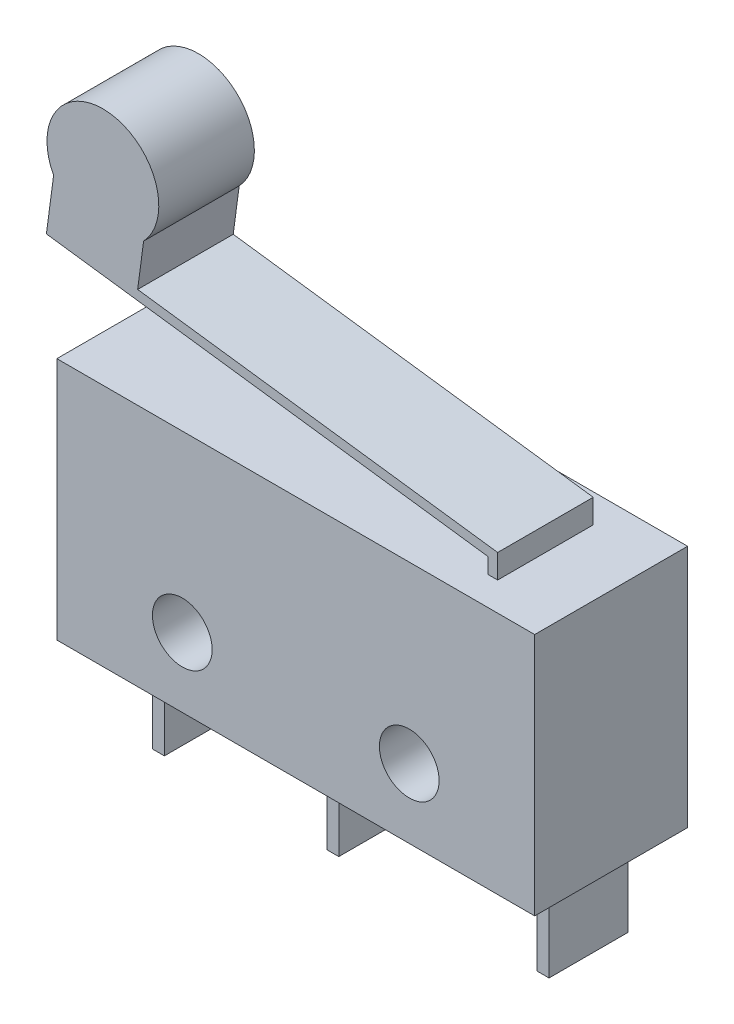
ISO-10303-21;
HEADER;
FILE_DESCRIPTION(('STEP AP214'),'2;1');
FILE_NAME('part.step','',(''),(''),'','','');
FILE_SCHEMA(('AUTOMOTIVE_DESIGN { 1 0 10303 214 1 1 1 1 }'));
ENDSEC;
DATA;
#1=APPLICATION_CONTEXT('core data for automotive mechanical design processes');
#2=APPLICATION_PROTOCOL_DEFINITION('international standard','automotive_design',2000,#1);
#3=PRODUCT_CONTEXT('',#1,'mechanical');
#4=PRODUCT('Part','Part','',(#3));
#5=PRODUCT_RELATED_PRODUCT_CATEGORY('part','',(#4));
#6=PRODUCT_DEFINITION_FORMATION('','',#4);
#7=PRODUCT_DEFINITION_CONTEXT('part definition',#1,'design');
#8=PRODUCT_DEFINITION('design','',#6,#7);
#9=PRODUCT_DEFINITION_SHAPE('','',#8);
#10=(LENGTH_UNIT() NAMED_UNIT(*) SI_UNIT(.MILLI.,.METRE.));
#11=(NAMED_UNIT(*) PLANE_ANGLE_UNIT() SI_UNIT($,.RADIAN.));
#12=(NAMED_UNIT(*) SI_UNIT($,.STERADIAN.) SOLID_ANGLE_UNIT());
#13=UNCERTAINTY_MEASURE_WITH_UNIT(LENGTH_MEASURE(1.E-05),#10,'distance_accuracy_value','');
#14=(GEOMETRIC_REPRESENTATION_CONTEXT(3) GLOBAL_UNCERTAINTY_ASSIGNED_CONTEXT((#13)) GLOBAL_UNIT_ASSIGNED_CONTEXT((#10,
#11,#12)) REPRESENTATION_CONTEXT('',''));
#15=CARTESIAN_POINT('',(0.,0.,0.));
#16=DIRECTION('',(0.,0.,1.));
#17=DIRECTION('',(1.,0.,0.));
#18=AXIS2_PLACEMENT_3D('',#15,#16,#17);
#19=CARTESIAN_POINT('',(-10.,-5.1,3.2));
#20=DIRECTION('',(0.,1.,0.));
#21=DIRECTION('',(0.,0.,1.));
#22=AXIS2_PLACEMENT_3D('',#19,#20,#21);
#23=PLANE('',#22);
#24=DIRECTION('',(-1.,0.,0.));
#25=VECTOR('',#24,1.);
#26=CARTESIAN_POINT('',(-7.05,-5.1,1.65));
#27=LINE('',#26,#25);
#28=CARTESIAN_POINT('',(-7.05,-5.1,1.65));
#29=VERTEX_POINT('',#28);
#30=CARTESIAN_POINT('',(-7.55,-5.1,1.65));
#31=VERTEX_POINT('',#30);
#32=EDGE_CURVE('E61',#29,#31,#27,.T.);
#33=ORIENTED_EDGE('',*,*,#32,.F.);
#34=DIRECTION('',(0.,0.,1.));
#35=VECTOR('',#34,1.);
#36=CARTESIAN_POINT('',(-7.05,-5.1,-1.65));
#37=LINE('',#36,#35);
#38=CARTESIAN_POINT('',(-7.05,-5.1,-1.65));
#39=VERTEX_POINT('',#38);
#40=EDGE_CURVE('E66',#39,#29,#37,.T.);
#41=ORIENTED_EDGE('',*,*,#40,.F.);
#42=DIRECTION('',(-1.,0.,0.));
#43=VECTOR('',#42,1.);
#44=CARTESIAN_POINT('',(-7.05,-5.1,-1.65));
#45=LINE('',#44,#43);
#46=CARTESIAN_POINT('',(-7.55,-5.1,-1.65));
#47=VERTEX_POINT('',#46);
#48=EDGE_CURVE('E230',#39,#47,#45,.T.);
#49=ORIENTED_EDGE('',*,*,#48,.T.);
#50=DIRECTION('',(0.,0.,1.));
#51=VECTOR('',#50,1.);
#52=CARTESIAN_POINT('',(-7.55,-5.1,-1.65));
#53=LINE('',#52,#51);
#54=EDGE_CURVE('E234',#47,#31,#53,.T.);
#55=ORIENTED_EDGE('',*,*,#54,.T.);
#56=EDGE_LOOP('',(#33,#41,#49,#55));
#57=FACE_BOUND('',#56,.T.);
#58=DIRECTION('',(1.,0.,0.));
#59=VECTOR('',#58,1.);
#60=CARTESIAN_POINT('',(-10.,-5.1,-3.2));
#61=LINE('',#60,#59);
#62=CARTESIAN_POINT('',(-10.,-5.1,-3.2));
#63=VERTEX_POINT('',#62);
#64=CARTESIAN_POINT('',(10.,-5.1,-3.2));
#65=VERTEX_POINT('',#64);
#66=EDGE_CURVE('E445',#63,#65,#61,.T.);
#67=ORIENTED_EDGE('',*,*,#66,.T.);
#68=DIRECTION('',(0.,0.,-1.));
#69=VECTOR('',#68,1.);
#70=CARTESIAN_POINT('',(10.,-5.1,3.2));
#71=LINE('',#70,#69);
#72=CARTESIAN_POINT('',(10.,-5.1,3.2));
#73=VERTEX_POINT('',#72);
#74=EDGE_CURVE('E454',#73,#65,#71,.T.);
#75=ORIENTED_EDGE('',*,*,#74,.F.);
#76=DIRECTION('',(1.,0.,0.));
#77=VECTOR('',#76,1.);
#78=CARTESIAN_POINT('',(-10.,-5.1,3.2));
#79=LINE('',#78,#77);
#80=CARTESIAN_POINT('',(-10.,-5.1,3.2));
#81=VERTEX_POINT('',#80);
#82=EDGE_CURVE('E451',#81,#73,#79,.T.);
#83=ORIENTED_EDGE('',*,*,#82,.F.);
#84=DIRECTION('',(0.,0.,-1.));
#85=VECTOR('',#84,1.);
#86=CARTESIAN_POINT('',(-10.,-5.1,3.2));
#87=LINE('',#86,#85);
#88=EDGE_CURVE('E469',#81,#63,#87,.T.);
#89=ORIENTED_EDGE('',*,*,#88,.T.);
#90=EDGE_LOOP('',(#67,#75,#83,#89));
#91=FACE_BOUND('',#90,.T.);
#92=DIRECTION('',(-1.,0.,0.));
#93=VECTOR('',#92,1.);
#94=CARTESIAN_POINT('',(0.25,-5.1,1.65));
#95=LINE('',#94,#93);
#96=CARTESIAN_POINT('',(0.25,-5.1,1.65));
#97=VERTEX_POINT('',#96);
#98=CARTESIAN_POINT('',(-0.25,-5.1,1.65));
#99=VERTEX_POINT('',#98);
#100=EDGE_CURVE('E335',#97,#99,#95,.T.);
#101=ORIENTED_EDGE('',*,*,#100,.F.);
#102=DIRECTION('',(0.,0.,1.));
#103=VECTOR('',#102,1.);
#104=CARTESIAN_POINT('',(0.25,-5.1,-1.65));
#105=LINE('',#104,#103);
#106=CARTESIAN_POINT('',(0.25,-5.1,-1.65));
#107=VERTEX_POINT('',#106);
#108=EDGE_CURVE('E298',#107,#97,#105,.T.);
#109=ORIENTED_EDGE('',*,*,#108,.F.);
#110=DIRECTION('',(-1.,0.,0.));
#111=VECTOR('',#110,1.);
#112=CARTESIAN_POINT('',(0.25,-5.1,-1.65));
#113=LINE('',#112,#111);
#114=CARTESIAN_POINT('',(-0.25,-5.1,-1.65));
#115=VERTEX_POINT('',#114);
#116=EDGE_CURVE('E313',#107,#115,#113,.T.);
#117=ORIENTED_EDGE('',*,*,#116,.T.);
#118=DIRECTION('',(0.,0.,1.));
#119=VECTOR('',#118,1.);
#120=CARTESIAN_POINT('',(-0.25,-5.1,-1.65));
#121=LINE('',#120,#119);
#122=EDGE_CURVE('E288',#115,#99,#121,.T.);
#123=ORIENTED_EDGE('',*,*,#122,.T.);
#124=EDGE_LOOP('',(#101,#109,#117,#123));
#125=FACE_BOUND('',#124,.T.);
#126=DIRECTION('',(0.,0.,1.));
#127=VECTOR('',#126,1.);
#128=CARTESIAN_POINT('',(8.55,-5.1,-1.65));
#129=LINE('',#128,#127);
#130=CARTESIAN_POINT('',(8.55,-5.1,-1.65));
#131=VERTEX_POINT('',#130);
#132=CARTESIAN_POINT('',(8.55,-5.1,1.65));
#133=VERTEX_POINT('',#132);
#134=EDGE_CURVE('E253',#131,#133,#129,.T.);
#135=ORIENTED_EDGE('',*,*,#134,.T.);
#136=DIRECTION('',(1.,0.,0.));
#137=VECTOR('',#136,1.);
#138=CARTESIAN_POINT('',(8.55,-5.1,1.65));
#139=LINE('',#138,#137);
#140=CARTESIAN_POINT('',(9.05,-5.1,1.65));
#141=VERTEX_POINT('',#140);
#142=EDGE_CURVE('E270',#133,#141,#139,.T.);
#143=ORIENTED_EDGE('',*,*,#142,.T.);
#144=DIRECTION('',(0.,0.,1.));
#145=VECTOR('',#144,1.);
#146=CARTESIAN_POINT('',(9.05,-5.1,-1.65));
#147=LINE('',#146,#145);
#148=CARTESIAN_POINT('',(9.05,-5.1,-1.65));
#149=VERTEX_POINT('',#148);
#150=EDGE_CURVE('E252',#149,#141,#147,.T.);
#151=ORIENTED_EDGE('',*,*,#150,.F.);
#152=DIRECTION('',(1.,0.,0.));
#153=VECTOR('',#152,1.);
#154=CARTESIAN_POINT('',(8.55,-5.1,-1.65));
#155=LINE('',#154,#153);
#156=EDGE_CURVE('E284',#131,#149,#155,.T.);
#157=ORIENTED_EDGE('',*,*,#156,.F.);
#158=EDGE_LOOP('',(#135,#143,#151,#157));
#159=FACE_BOUND('',#158,.T.);
#160=ADVANCED_FACE('F45',(#57,#91,#125,#159),#23,.F.);
#161=CARTESIAN_POINT('',(0.,0.,3.2));
#162=DIRECTION('',(0.,0.,-1.));
#163=DIRECTION('',(-1.,0.,0.));
#164=AXIS2_PLACEMENT_3D('',#161,#162,#163);
#165=PLANE('',#164);
#166=DIRECTION('',(0.,1.,0.));
#167=VECTOR('',#166,1.);
#168=CARTESIAN_POINT('',(10.,-5.1,3.2));
#169=LINE('',#168,#167);
#170=CARTESIAN_POINT('',(10.,5.1,3.2));
#171=VERTEX_POINT('',#170);
#172=EDGE_CURVE('E440',#73,#171,#169,.T.);
#173=ORIENTED_EDGE('',*,*,#172,.T.);
#174=DIRECTION('',(-1.,0.,0.));
#175=VECTOR('',#174,1.);
#176=CARTESIAN_POINT('',(-10.,5.1,3.2));
#177=LINE('',#176,#175);
#178=CARTESIAN_POINT('',(-10.,5.1,3.2));
#179=VERTEX_POINT('',#178);
#180=EDGE_CURVE('E444',#171,#179,#177,.T.);
#181=ORIENTED_EDGE('',*,*,#180,.T.);
#182=DIRECTION('',(0.,-1.,0.));
#183=VECTOR('',#182,1.);
#184=CARTESIAN_POINT('',(-10.,-5.1,3.2));
#185=LINE('',#184,#183);
#186=EDGE_CURVE('E448',#179,#81,#185,.T.);
#187=ORIENTED_EDGE('',*,*,#186,.T.);
#188=ORIENTED_EDGE('',*,*,#82,.T.);
#189=EDGE_LOOP('',(#173,#181,#187,#188));
#190=FACE_BOUND('',#189,.T.);
#191=CARTESIAN_POINT('',(-4.75,-2.2,3.2));
#192=DIRECTION('',(0.,0.,1.));
#193=DIRECTION('',(1.,0.,0.));
#194=AXIS2_PLACEMENT_3D('',#191,#192,#193);
#195=CIRCLE('',#194,1.25);
#196=CARTESIAN_POINT('',(-3.5,-2.2,3.2));
#197=VERTEX_POINT('',#196);
#198=EDGE_CURVE('E432',#197,#197,#195,.T.);
#199=ORIENTED_EDGE('',*,*,#198,.F.);
#200=EDGE_LOOP('',(#199));
#201=FACE_BOUND('',#200,.T.);
#202=CARTESIAN_POINT('',(4.75,-2.2,3.2));
#203=DIRECTION('',(0.,0.,1.));
#204=DIRECTION('',(1.,0.,0.));
#205=AXIS2_PLACEMENT_3D('',#202,#203,#204);
#206=CIRCLE('',#205,1.25);
#207=CARTESIAN_POINT('',(6.,-2.2,3.2));
#208=VERTEX_POINT('',#207);
#209=EDGE_CURVE('E424',#208,#208,#206,.T.);
#210=ORIENTED_EDGE('',*,*,#209,.F.);
#211=EDGE_LOOP('',(#210));
#212=FACE_BOUND('',#211,.T.);
#213=ADVANCED_FACE('F494',(#190,#201,#212),#165,.F.);
#214=CARTESIAN_POINT('',(0.,0.,-3.2));
#215=DIRECTION('',(0.,0.,-1.));
#216=DIRECTION('',(-1.,0.,0.));
#217=AXIS2_PLACEMENT_3D('',#214,#215,#216);
#218=PLANE('',#217);
#219=CARTESIAN_POINT('',(-4.75,-2.2,-3.2));
#220=DIRECTION('',(0.,0.,1.));
#221=DIRECTION('',(1.,0.,0.));
#222=AXIS2_PLACEMENT_3D('',#219,#220,#221);
#223=CIRCLE('',#222,1.25);
#224=CARTESIAN_POINT('',(-3.5,-2.2,-3.2));
#225=VERTEX_POINT('',#224);
#226=EDGE_CURVE('E428',#225,#225,#223,.T.);
#227=ORIENTED_EDGE('',*,*,#226,.T.);
#228=EDGE_LOOP('',(#227));
#229=FACE_BOUND('',#228,.T.);
#230=DIRECTION('',(0.,1.,0.));
#231=VECTOR('',#230,1.);
#232=CARTESIAN_POINT('',(10.,-5.1,-3.2));
#233=LINE('',#232,#231);
#234=CARTESIAN_POINT('',(10.,5.1,-3.2));
#235=VERTEX_POINT('',#234);
#236=EDGE_CURVE('E436',#65,#235,#233,.T.);
#237=ORIENTED_EDGE('',*,*,#236,.F.);
#238=ORIENTED_EDGE('',*,*,#66,.F.);
#239=DIRECTION('',(0.,-1.,0.));
#240=VECTOR('',#239,1.);
#241=CARTESIAN_POINT('',(-10.,-5.1,-3.2));
#242=LINE('',#241,#240);
#243=CARTESIAN_POINT('',(-10.,5.1,-3.2));
#244=VERTEX_POINT('',#243);
#245=EDGE_CURVE('E461',#244,#63,#242,.T.);
#246=ORIENTED_EDGE('',*,*,#245,.F.);
#247=DIRECTION('',(-1.,0.,0.));
#248=VECTOR('',#247,1.);
#249=CARTESIAN_POINT('',(-10.,5.1,-3.2));
#250=LINE('',#249,#248);
#251=EDGE_CURVE('E458',#235,#244,#250,.T.);
#252=ORIENTED_EDGE('',*,*,#251,.F.);
#253=EDGE_LOOP('',(#237,#238,#246,#252));
#254=FACE_BOUND('',#253,.T.);
#255=CARTESIAN_POINT('',(4.75,-2.2,-3.2));
#256=DIRECTION('',(0.,0.,1.));
#257=DIRECTION('',(1.,0.,0.));
#258=AXIS2_PLACEMENT_3D('',#255,#256,#257);
#259=CIRCLE('',#258,1.25);
#260=CARTESIAN_POINT('',(6.,-2.2,-3.2));
#261=VERTEX_POINT('',#260);
#262=EDGE_CURVE('E423',#261,#261,#259,.T.);
#263=ORIENTED_EDGE('',*,*,#262,.T.);
#264=EDGE_LOOP('',(#263));
#265=FACE_BOUND('',#264,.T.);
#266=ADVANCED_FACE('F484',(#229,#254,#265),#218,.T.);
#267=CARTESIAN_POINT('',(10.,-5.1,3.2));
#268=DIRECTION('',(-1.,0.,0.));
#269=DIRECTION('',(0.,0.,1.));
#270=AXIS2_PLACEMENT_3D('',#267,#268,#269);
#271=PLANE('',#270);
#272=ORIENTED_EDGE('',*,*,#236,.T.);
#273=DIRECTION('',(0.,0.,-1.));
#274=VECTOR('',#273,1.);
#275=CARTESIAN_POINT('',(10.,5.1,3.2));
#276=LINE('',#275,#274);
#277=EDGE_CURVE('E11',#171,#235,#276,.T.);
#278=ORIENTED_EDGE('',*,*,#277,.F.);
#279=ORIENTED_EDGE('',*,*,#172,.F.);
#280=ORIENTED_EDGE('',*,*,#74,.T.);
#281=EDGE_LOOP('',(#272,#278,#279,#280));
#282=FACE_BOUND('',#281,.T.);
#283=ADVANCED_FACE('F47',(#282),#271,.F.);
#284=CARTESIAN_POINT('',(-10.,5.1,3.2));
#285=DIRECTION('',(0.,-1.,0.));
#286=DIRECTION('',(0.,0.,-1.));
#287=AXIS2_PLACEMENT_3D('',#284,#285,#286);
#288=PLANE('',#287);
#289=DIRECTION('',(0.,0.,-1.));
#290=VECTOR('',#289,1.);
#291=CARTESIAN_POINT('',(7.25,5.1,2.));
#292=LINE('',#291,#290);
#293=CARTESIAN_POINT('',(7.25,5.1,2.));
#294=VERTEX_POINT('',#293);
#295=CARTESIAN_POINT('',(7.25,5.1,-2.));
#296=VERTEX_POINT('',#295);
#297=EDGE_CURVE('E368',#294,#296,#292,.T.);
#298=ORIENTED_EDGE('',*,*,#297,.F.);
#299=DIRECTION('',(1.,0.,0.));
#300=VECTOR('',#299,1.);
#301=CARTESIAN_POINT('',(7.25,5.1,2.));
#302=LINE('',#301,#300);
#303=CARTESIAN_POINT('',(6.85,5.1,2.));
#304=VERTEX_POINT('',#303);
#305=EDGE_CURVE('E364',#304,#294,#302,.T.);
#306=ORIENTED_EDGE('',*,*,#305,.F.);
#307=DIRECTION('',(0.,0.,-1.));
#308=VECTOR('',#307,1.);
#309=CARTESIAN_POINT('',(6.85,5.1,2.));
#310=LINE('',#309,#308);
#311=CARTESIAN_POINT('',(6.85,5.1,-2.));
#312=VERTEX_POINT('',#311);
#313=EDGE_CURVE('E396',#304,#312,#310,.T.);
#314=ORIENTED_EDGE('',*,*,#313,.T.);
#315=DIRECTION('',(1.,0.,0.));
#316=VECTOR('',#315,1.);
#317=CARTESIAN_POINT('',(7.25,5.1,-2.));
#318=LINE('',#317,#316);
#319=EDGE_CURVE('E345',#312,#296,#318,.T.);
#320=ORIENTED_EDGE('',*,*,#319,.T.);
#321=EDGE_LOOP('',(#298,#306,#314,#320));
#322=FACE_BOUND('',#321,.T.);
#323=ORIENTED_EDGE('',*,*,#251,.T.);
#324=DIRECTION('',(0.,0.,-1.));
#325=VECTOR('',#324,1.);
#326=CARTESIAN_POINT('',(-10.,5.1,3.2));
#327=LINE('',#326,#325);
#328=EDGE_CURVE('E54',#179,#244,#327,.T.);
#329=ORIENTED_EDGE('',*,*,#328,.F.);
#330=ORIENTED_EDGE('',*,*,#180,.F.);
#331=ORIENTED_EDGE('',*,*,#277,.T.);
#332=EDGE_LOOP('',(#323,#329,#330,#331));
#333=FACE_BOUND('',#332,.T.);
#334=ADVANCED_FACE('F496',(#322,#333),#288,.F.);
#335=CARTESIAN_POINT('',(-10.,-5.1,3.2));
#336=DIRECTION('',(1.,0.,0.));
#337=DIRECTION('',(0.,0.,-1.));
#338=AXIS2_PLACEMENT_3D('',#335,#336,#337);
#339=PLANE('',#338);
#340=ORIENTED_EDGE('',*,*,#245,.T.);
#341=ORIENTED_EDGE('',*,*,#88,.F.);
#342=ORIENTED_EDGE('',*,*,#186,.F.);
#343=ORIENTED_EDGE('',*,*,#328,.T.);
#344=EDGE_LOOP('',(#340,#341,#342,#343));
#345=FACE_BOUND('',#344,.T.);
#346=ADVANCED_FACE('F478',(#345),#339,.F.);
#347=CARTESIAN_POINT('',(-4.75,-2.2,3.2));
#348=DIRECTION('',(0.,0.,-1.));
#349=DIRECTION('',(-1.,0.,0.));
#350=AXIS2_PLACEMENT_3D('',#347,#348,#349);
#351=CYLINDRICAL_SURFACE('',#350,1.25);
#352=ORIENTED_EDGE('',*,*,#198,.T.);
#353=EDGE_LOOP('',(#352));
#354=FACE_BOUND('',#353,.T.);
#355=ORIENTED_EDGE('',*,*,#226,.F.);
#356=EDGE_LOOP('',(#355));
#357=FACE_BOUND('',#356,.T.);
#358=ADVANCED_FACE('F504',(#354,#357),#351,.F.);
#359=CARTESIAN_POINT('',(4.75,-2.2,3.2));
#360=DIRECTION('',(0.,0.,-1.));
#361=DIRECTION('',(-1.,0.,0.));
#362=AXIS2_PLACEMENT_3D('',#359,#360,#361);
#363=CYLINDRICAL_SURFACE('',#362,1.25);
#364=ORIENTED_EDGE('',*,*,#209,.T.);
#365=EDGE_LOOP('',(#364));
#366=FACE_BOUND('',#365,.T.);
#367=ORIENTED_EDGE('',*,*,#262,.F.);
#368=EDGE_LOOP('',(#367));
#369=FACE_BOUND('',#368,.T.);
#370=ADVANCED_FACE('F521',(#366,#369),#363,.F.);
#371=CARTESIAN_POINT('',(7.25,6.1,2.));
#372=DIRECTION('',(-1.,0.,0.));
#373=DIRECTION('',(0.,0.,1.));
#374=AXIS2_PLACEMENT_3D('',#371,#372,#373);
#375=PLANE('',#374);
#376=DIRECTION('',(0.,1.,0.));
#377=VECTOR('',#376,1.);
#378=CARTESIAN_POINT('',(7.25,6.1,-2.));
#379=LINE('',#378,#377);
#380=CARTESIAN_POINT('',(7.25,6.1,-2.));
#381=VERTEX_POINT('',#380);
#382=EDGE_CURVE('E339',#296,#381,#379,.T.);
#383=ORIENTED_EDGE('',*,*,#382,.T.);
#384=DIRECTION('',(0.,0.,-1.));
#385=VECTOR('',#384,1.);
#386=CARTESIAN_POINT('',(7.25,6.1,2.));
#387=LINE('',#386,#385);
#388=CARTESIAN_POINT('',(7.25,6.1,2.));
#389=VERTEX_POINT('',#388);
#390=EDGE_CURVE('E419',#389,#381,#387,.T.);
#391=ORIENTED_EDGE('',*,*,#390,.F.);
#392=DIRECTION('',(0.,1.,0.));
#393=VECTOR('',#392,1.);
#394=CARTESIAN_POINT('',(7.25,6.1,2.));
#395=LINE('',#394,#393);
#396=EDGE_CURVE('E340',#294,#389,#395,.T.);
#397=ORIENTED_EDGE('',*,*,#396,.F.);
#398=ORIENTED_EDGE('',*,*,#297,.T.);
#399=EDGE_LOOP('',(#383,#391,#397,#398));
#400=FACE_BOUND('',#399,.T.);
#401=ADVANCED_FACE('F524',(#400),#375,.F.);
#402=CARTESIAN_POINT('',(-7.81800832617472,8.0987808990305,2.));
#403=DIRECTION('',(-0.13149874335727,-0.991316337248337,0.));
#404=DIRECTION('',(0.991316337248337,-0.13149874335727,0.));
#405=AXIS2_PLACEMENT_3D('',#402,#403,#404);
#406=PLANE('',#405);
#407=DIRECTION('',(-0.991316337248337,0.13149874335727,0.));
#408=VECTOR('',#407,1.);
#409=CARTESIAN_POINT('',(-7.81800832617472,8.0987808990305,-2.));
#410=LINE('',#409,#408);
#411=CARTESIAN_POINT('',(-7.81800832617472,8.0987808990305,-2.));
#412=VERTEX_POINT('',#411);
#413=EDGE_CURVE('E372',#381,#412,#410,.T.);
#414=ORIENTED_EDGE('',*,*,#413,.T.);
#415=DIRECTION('',(0.,0.,-1.));
#416=VECTOR('',#415,1.);
#417=CARTESIAN_POINT('',(-7.81800832617472,8.0987808990305,2.));
#418=LINE('',#417,#416);
#419=CARTESIAN_POINT('',(-7.81800832617472,8.0987808990305,2.));
#420=VERTEX_POINT('',#419);
#421=EDGE_CURVE('E415',#420,#412,#418,.T.);
#422=ORIENTED_EDGE('',*,*,#421,.F.);
#423=DIRECTION('',(-0.991316337248337,0.13149874335727,0.));
#424=VECTOR('',#423,1.);
#425=CARTESIAN_POINT('',(-7.81800832617472,8.0987808990305,2.));
#426=LINE('',#425,#424);
#427=EDGE_CURVE('E344',#389,#420,#426,.T.);
#428=ORIENTED_EDGE('',*,*,#427,.F.);
#429=ORIENTED_EDGE('',*,*,#390,.T.);
#430=EDGE_LOOP('',(#414,#422,#428,#429));
#431=FACE_BOUND('',#430,.T.);
#432=ADVANCED_FACE('F527',(#431),#406,.F.);
#433=CARTESIAN_POINT('',(-7.56893257017051,9.97646322386167,2.));
#434=DIRECTION('',(-0.991316337248337,0.131498743357271,0.));
#435=DIRECTION('',(-0.131498743357271,-0.991316337248337,0.));
#436=AXIS2_PLACEMENT_3D('',#433,#434,#435);
#437=PLANE('',#436);
#438=DIRECTION('',(0.131498743357271,0.991316337248337,0.));
#439=VECTOR('',#438,1.);
#440=CARTESIAN_POINT('',(-7.56893257017051,9.97646322386167,-2.));
#441=LINE('',#440,#439);
#442=CARTESIAN_POINT('',(-7.56893257017051,9.97646322386167,-2.));
#443=VERTEX_POINT('',#442);
#444=EDGE_CURVE('E375',#412,#443,#441,.T.);
#445=ORIENTED_EDGE('',*,*,#444,.T.);
#446=DIRECTION('',(0.,0.,-1.));
#447=VECTOR('',#446,1.);
#448=CARTESIAN_POINT('',(-7.56893257017051,9.97646322386167,2.));
#449=LINE('',#448,#447);
#450=CARTESIAN_POINT('',(-7.56893257017051,9.97646322386167,2.));
#451=VERTEX_POINT('',#450);
#452=EDGE_CURVE('E411',#451,#443,#449,.T.);
#453=ORIENTED_EDGE('',*,*,#452,.F.);
#454=DIRECTION('',(0.131498743357271,0.991316337248337,0.));
#455=VECTOR('',#454,1.);
#456=CARTESIAN_POINT('',(-7.56893257017051,9.97646322386167,2.));
#457=LINE('',#456,#455);
#458=EDGE_CURVE('E348',#420,#451,#457,.T.);
#459=ORIENTED_EDGE('',*,*,#458,.F.);
#460=ORIENTED_EDGE('',*,*,#421,.T.);
#461=EDGE_LOOP('',(#445,#453,#459,#460));
#462=FACE_BOUND('',#461,.T.);
#463=ADVANCED_FACE('F531',(#462),#437,.F.);
#464=CARTESIAN_POINT('',(-9.27282346360186,11.5803197708389,2.));
#465=DIRECTION('',(0.,0.,-1.));
#466=DIRECTION('',(-1.,0.,0.));
#467=AXIS2_PLACEMENT_3D('',#464,#465,#466);
#468=CYLINDRICAL_SURFACE('',#467,2.34);
#469=CARTESIAN_POINT('',(-9.27282346360186,11.5803197708389,-2.));
#470=DIRECTION('',(0.,0.,1.));
#471=DIRECTION('',(1.,0.,0.));
#472=AXIS2_PLACEMENT_3D('',#469,#470,#471);
#473=CIRCLE('',#472,2.34);
#474=CARTESIAN_POINT('',(-11.3359346517142,10.4761584486193,-2.));
#475=VERTEX_POINT('',#474);
#476=EDGE_CURVE('E378',#443,#475,#473,.T.);
#477=ORIENTED_EDGE('',*,*,#476,.T.);
#478=DIRECTION('',(0.,0.,-1.));
#479=VECTOR('',#478,1.);
#480=CARTESIAN_POINT('',(-11.3359346517142,10.4761584486193,2.));
#481=LINE('',#480,#479);
#482=CARTESIAN_POINT('',(-11.3359346517142,10.4761584486193,2.));
#483=VERTEX_POINT('',#482);
#484=EDGE_CURVE('E407',#483,#475,#481,.T.);
#485=ORIENTED_EDGE('',*,*,#484,.F.);
#486=CARTESIAN_POINT('',(-9.27282346360186,11.5803197708389,2.));
#487=DIRECTION('',(0.,0.,1.));
#488=DIRECTION('',(1.,0.,0.));
#489=AXIS2_PLACEMENT_3D('',#486,#487,#488);
#490=CIRCLE('',#489,2.34);
#491=EDGE_CURVE('E351',#451,#483,#490,.T.);
#492=ORIENTED_EDGE('',*,*,#491,.F.);
#493=ORIENTED_EDGE('',*,*,#452,.T.);
#494=EDGE_LOOP('',(#477,#485,#492,#493));
#495=FACE_BOUND('',#494,.T.);
#496=ADVANCED_FACE('F535',(#495),#468,.T.);
#497=CARTESIAN_POINT('',(-11.3359346517142,10.4761584486193,2.));
#498=DIRECTION('',(0.991316337248337,-0.13149874335727,0.));
#499=DIRECTION('',(0.13149874335727,0.991316337248337,0.));
#500=AXIS2_PLACEMENT_3D('',#497,#498,#499);
#501=PLANE('',#500);
#502=DIRECTION('',(-0.13149874335727,-0.991316337248337,0.));
#503=VECTOR('',#502,1.);
#504=CARTESIAN_POINT('',(-11.3359346517142,10.4761584486193,-2.));
#505=LINE('',#504,#503);
#506=CARTESIAN_POINT('',(-11.6376099050613,8.20194958888879,-2.));
#507=VERTEX_POINT('',#506);
#508=EDGE_CURVE('E381',#475,#507,#505,.T.);
#509=ORIENTED_EDGE('',*,*,#508,.T.);
#510=DIRECTION('',(0.,0.,-1.));
#511=VECTOR('',#510,1.);
#512=CARTESIAN_POINT('',(-11.6376099050613,8.20194958888879,2.));
#513=LINE('',#512,#511);
#514=CARTESIAN_POINT('',(-11.6376099050613,8.20194958888879,2.));
#515=VERTEX_POINT('',#514);
#516=EDGE_CURVE('E403',#515,#507,#513,.T.);
#517=ORIENTED_EDGE('',*,*,#516,.F.);
#518=DIRECTION('',(-0.13149874335727,-0.991316337248337,0.));
#519=VECTOR('',#518,1.);
#520=CARTESIAN_POINT('',(-11.3359346517142,10.4761584486193,2.));
#521=LINE('',#520,#519);
#522=EDGE_CURVE('E354',#483,#515,#521,.T.);
#523=ORIENTED_EDGE('',*,*,#522,.F.);
#524=ORIENTED_EDGE('',*,*,#484,.T.);
#525=EDGE_LOOP('',(#509,#517,#523,#524));
#526=FACE_BOUND('',#525,.T.);
#527=ADVANCED_FACE('F539',(#526),#501,.F.);
#528=CARTESIAN_POINT('',(6.85,5.74955636298561,2.));
#529=DIRECTION('',(0.13149874335727,0.991316337248337,0.));
#530=DIRECTION('',(-0.991316337248337,0.13149874335727,0.));
#531=AXIS2_PLACEMENT_3D('',#528,#529,#530);
#532=PLANE('',#531);
#533=DIRECTION('',(0.991316337248337,-0.13149874335727,0.));
#534=VECTOR('',#533,1.);
#535=CARTESIAN_POINT('',(6.85,5.74955636298561,-2.));
#536=LINE('',#535,#534);
#537=CARTESIAN_POINT('',(6.85,5.74955636298561,-2.));
#538=VERTEX_POINT('',#537);
#539=EDGE_CURVE('E384',#507,#538,#536,.T.);
#540=ORIENTED_EDGE('',*,*,#539,.T.);
#541=DIRECTION('',(0.,0.,-1.));
#542=VECTOR('',#541,1.);
#543=CARTESIAN_POINT('',(6.85,5.74955636298561,2.));
#544=LINE('',#543,#542);
#545=CARTESIAN_POINT('',(6.85,5.74955636298561,2.));
#546=VERTEX_POINT('',#545);
#547=EDGE_CURVE('E399',#546,#538,#544,.T.);
#548=ORIENTED_EDGE('',*,*,#547,.F.);
#549=DIRECTION('',(0.991316337248337,-0.13149874335727,0.));
#550=VECTOR('',#549,1.);
#551=CARTESIAN_POINT('',(6.85,5.74955636298561,2.));
#552=LINE('',#551,#550);
#553=EDGE_CURVE('E357',#515,#546,#552,.T.);
#554=ORIENTED_EDGE('',*,*,#553,.F.);
#555=ORIENTED_EDGE('',*,*,#516,.T.);
#556=EDGE_LOOP('',(#540,#548,#554,#555));
#557=FACE_BOUND('',#556,.T.);
#558=ADVANCED_FACE('F543',(#557),#532,.F.);
#559=CARTESIAN_POINT('',(6.85,5.1,2.));
#560=DIRECTION('',(1.,0.,0.));
#561=DIRECTION('',(0.,0.,-1.));
#562=AXIS2_PLACEMENT_3D('',#559,#560,#561);
#563=PLANE('',#562);
#564=DIRECTION('',(0.,-1.,0.));
#565=VECTOR('',#564,1.);
#566=CARTESIAN_POINT('',(6.85,5.1,-2.));
#567=LINE('',#566,#565);
#568=EDGE_CURVE('E387',#538,#312,#567,.T.);
#569=ORIENTED_EDGE('',*,*,#568,.T.);
#570=ORIENTED_EDGE('',*,*,#313,.F.);
#571=DIRECTION('',(0.,-1.,0.));
#572=VECTOR('',#571,1.);
#573=CARTESIAN_POINT('',(6.85,5.1,2.));
#574=LINE('',#573,#572);
#575=EDGE_CURVE('E360',#546,#304,#574,.T.);
#576=ORIENTED_EDGE('',*,*,#575,.F.);
#577=ORIENTED_EDGE('',*,*,#547,.T.);
#578=EDGE_LOOP('',(#569,#570,#576,#577));
#579=FACE_BOUND('',#578,.T.);
#580=ADVANCED_FACE('F547',(#579),#563,.F.);
#581=CARTESIAN_POINT('',(-9.27282346360186,11.5803197708389,2.));
#582=DIRECTION('',(0.,0.,1.));
#583=DIRECTION('',(1.,0.,0.));
#584=AXIS2_PLACEMENT_3D('',#581,#582,#583);
#585=PLANE('',#584);
#586=ORIENTED_EDGE('',*,*,#396,.T.);
#587=ORIENTED_EDGE('',*,*,#427,.T.);
#588=ORIENTED_EDGE('',*,*,#458,.T.);
#589=ORIENTED_EDGE('',*,*,#491,.T.);
#590=ORIENTED_EDGE('',*,*,#522,.T.);
#591=ORIENTED_EDGE('',*,*,#553,.T.);
#592=ORIENTED_EDGE('',*,*,#575,.T.);
#593=ORIENTED_EDGE('',*,*,#305,.T.);
#594=EDGE_LOOP('',(#586,#587,#588,#589,#590,#591,#592,#593));
#595=FACE_BOUND('',#594,.T.);
#596=ADVANCED_FACE('F551',(#595),#585,.T.);
#597=CARTESIAN_POINT('',(-9.27282346360186,11.5803197708389,-2.));
#598=DIRECTION('',(0.,0.,1.));
#599=DIRECTION('',(1.,0.,0.));
#600=AXIS2_PLACEMENT_3D('',#597,#598,#599);
#601=PLANE('',#600);
#602=ORIENTED_EDGE('',*,*,#382,.F.);
#603=ORIENTED_EDGE('',*,*,#319,.F.);
#604=ORIENTED_EDGE('',*,*,#568,.F.);
#605=ORIENTED_EDGE('',*,*,#539,.F.);
#606=ORIENTED_EDGE('',*,*,#508,.F.);
#607=ORIENTED_EDGE('',*,*,#476,.F.);
#608=ORIENTED_EDGE('',*,*,#444,.F.);
#609=ORIENTED_EDGE('',*,*,#413,.F.);
#610=EDGE_LOOP('',(#602,#603,#604,#605,#606,#607,#608,#609));
#611=FACE_BOUND('',#610,.T.);
#612=ADVANCED_FACE('F553',(#611),#601,.F.);
#613=CARTESIAN_POINT('',(0.25,-5.1,1.65));
#614=DIRECTION('',(0.,0.,-1.));
#615=DIRECTION('',(0.,1.,0.));
#616=AXIS2_PLACEMENT_3D('',#613,#614,#615);
#617=PLANE('',#616);
#618=DIRECTION('',(0.,-1.,0.));
#619=VECTOR('',#618,1.);
#620=CARTESIAN_POINT('',(-0.25,-5.1,1.65));
#621=LINE('',#620,#619);
#622=CARTESIAN_POINT('',(-0.25,-8.6,1.65));
#623=VERTEX_POINT('',#622);
#624=EDGE_CURVE('E316',#99,#623,#621,.T.);
#625=ORIENTED_EDGE('',*,*,#624,.T.);
#626=DIRECTION('',(-1.,0.,0.));
#627=VECTOR('',#626,1.);
#628=CARTESIAN_POINT('',(0.25,-8.6,1.65));
#629=LINE('',#628,#627);
#630=CARTESIAN_POINT('',(0.25,-8.6,1.65));
#631=VERTEX_POINT('',#630);
#632=EDGE_CURVE('E331',#631,#623,#629,.T.);
#633=ORIENTED_EDGE('',*,*,#632,.F.);
#634=DIRECTION('',(0.,-1.,0.));
#635=VECTOR('',#634,1.);
#636=CARTESIAN_POINT('',(0.25,-5.1,1.65));
#637=LINE('',#636,#635);
#638=EDGE_CURVE('E302',#97,#631,#637,.T.);
#639=ORIENTED_EDGE('',*,*,#638,.F.);
#640=ORIENTED_EDGE('',*,*,#100,.T.);
#641=EDGE_LOOP('',(#625,#633,#639,#640));
#642=FACE_BOUND('',#641,.T.);
#643=ADVANCED_FACE('F556',(#642),#617,.F.);
#644=CARTESIAN_POINT('',(0.25,-8.6,1.65));
#645=DIRECTION('',(0.,1.,0.));
#646=DIRECTION('',(0.,0.,1.));
#647=AXIS2_PLACEMENT_3D('',#644,#645,#646);
#648=PLANE('',#647);
#649=DIRECTION('',(0.,0.,-1.));
#650=VECTOR('',#649,1.);
#651=CARTESIAN_POINT('',(-0.25,-8.6,1.65));
#652=LINE('',#651,#650);
#653=CARTESIAN_POINT('',(-0.25,-8.6,-1.65));
#654=VERTEX_POINT('',#653);
#655=EDGE_CURVE('E319',#623,#654,#652,.T.);
#656=ORIENTED_EDGE('',*,*,#655,.T.);
#657=DIRECTION('',(-1.,0.,0.));
#658=VECTOR('',#657,1.);
#659=CARTESIAN_POINT('',(0.25,-8.6,-1.65));
#660=LINE('',#659,#658);
#661=CARTESIAN_POINT('',(0.25,-8.6,-1.65));
#662=VERTEX_POINT('',#661);
#663=EDGE_CURVE('E327',#662,#654,#660,.T.);
#664=ORIENTED_EDGE('',*,*,#663,.F.);
#665=DIRECTION('',(0.,0.,-1.));
#666=VECTOR('',#665,1.);
#667=CARTESIAN_POINT('',(0.25,-8.6,1.65));
#668=LINE('',#667,#666);
#669=EDGE_CURVE('E306',#631,#662,#668,.T.);
#670=ORIENTED_EDGE('',*,*,#669,.F.);
#671=ORIENTED_EDGE('',*,*,#632,.T.);
#672=EDGE_LOOP('',(#656,#664,#670,#671));
#673=FACE_BOUND('',#672,.T.);
#674=ADVANCED_FACE('F563',(#673),#648,.F.);
#675=CARTESIAN_POINT('',(0.25,-8.6,-1.65));
#676=DIRECTION('',(0.,0.,1.));
#677=DIRECTION('',(0.,-1.,0.));
#678=AXIS2_PLACEMENT_3D('',#675,#676,#677);
#679=PLANE('',#678);
#680=DIRECTION('',(0.,1.,0.));
#681=VECTOR('',#680,1.);
#682=CARTESIAN_POINT('',(-0.25,-8.6,-1.65));
#683=LINE('',#682,#681);
#684=EDGE_CURVE('E303',#654,#115,#683,.T.);
#685=ORIENTED_EDGE('',*,*,#684,.T.);
#686=ORIENTED_EDGE('',*,*,#116,.F.);
#687=DIRECTION('',(0.,1.,0.));
#688=VECTOR('',#687,1.);
#689=CARTESIAN_POINT('',(0.25,-8.6,-1.65));
#690=LINE('',#689,#688);
#691=EDGE_CURVE('E309',#662,#107,#690,.T.);
#692=ORIENTED_EDGE('',*,*,#691,.F.);
#693=ORIENTED_EDGE('',*,*,#663,.T.);
#694=EDGE_LOOP('',(#685,#686,#692,#693));
#695=FACE_BOUND('',#694,.T.);
#696=ADVANCED_FACE('F567',(#695),#679,.F.);
#697=CARTESIAN_POINT('',(0.25,0.,0.));
#698=DIRECTION('',(1.,0.,0.));
#699=DIRECTION('',(0.,0.,-1.));
#700=AXIS2_PLACEMENT_3D('',#697,#698,#699);
#701=PLANE('',#700);
#702=ORIENTED_EDGE('',*,*,#108,.T.);
#703=ORIENTED_EDGE('',*,*,#638,.T.);
#704=ORIENTED_EDGE('',*,*,#669,.T.);
#705=ORIENTED_EDGE('',*,*,#691,.T.);
#706=EDGE_LOOP('',(#702,#703,#704,#705));
#707=FACE_BOUND('',#706,.T.);
#708=ADVANCED_FACE('F571',(#707),#701,.T.);
#709=CARTESIAN_POINT('',(-0.25,0.,0.));
#710=DIRECTION('',(1.,0.,0.));
#711=DIRECTION('',(0.,0.,-1.));
#712=AXIS2_PLACEMENT_3D('',#709,#710,#711);
#713=PLANE('',#712);
#714=ORIENTED_EDGE('',*,*,#122,.F.);
#715=ORIENTED_EDGE('',*,*,#684,.F.);
#716=ORIENTED_EDGE('',*,*,#655,.F.);
#717=ORIENTED_EDGE('',*,*,#624,.F.);
#718=EDGE_LOOP('',(#714,#715,#716,#717));
#719=FACE_BOUND('',#718,.T.);
#720=ADVANCED_FACE('F573',(#719),#713,.F.);
#721=CARTESIAN_POINT('',(8.55,-8.6,-1.65));
#722=DIRECTION('',(0.,0.,-1.));
#723=DIRECTION('',(0.,1.,0.));
#724=AXIS2_PLACEMENT_3D('',#721,#722,#723);
#725=PLANE('',#724);
#726=DIRECTION('',(0.,1.,0.));
#727=VECTOR('',#726,1.);
#728=CARTESIAN_POINT('',(9.05,-8.6,-1.65));
#729=LINE('',#728,#727);
#730=CARTESIAN_POINT('',(9.05,-8.6,-1.65));
#731=VERTEX_POINT('',#730);
#732=EDGE_CURVE('E258',#731,#149,#729,.T.);
#733=ORIENTED_EDGE('',*,*,#732,.F.);
#734=DIRECTION('',(1.,0.,0.));
#735=VECTOR('',#734,1.);
#736=CARTESIAN_POINT('',(8.55,-8.6,-1.65));
#737=LINE('',#736,#735);
#738=CARTESIAN_POINT('',(8.55,-8.6,-1.65));
#739=VERTEX_POINT('',#738);
#740=EDGE_CURVE('E289',#739,#731,#737,.T.);
#741=ORIENTED_EDGE('',*,*,#740,.F.);
#742=DIRECTION('',(0.,1.,0.));
#743=VECTOR('',#742,1.);
#744=CARTESIAN_POINT('',(8.55,-8.6,-1.65));
#745=LINE('',#744,#743);
#746=EDGE_CURVE('E266',#739,#131,#745,.T.);
#747=ORIENTED_EDGE('',*,*,#746,.T.);
#748=ORIENTED_EDGE('',*,*,#156,.T.);
#749=EDGE_LOOP('',(#733,#741,#747,#748));
#750=FACE_BOUND('',#749,.T.);
#751=ADVANCED_FACE('F576',(#750),#725,.T.);
#752=CARTESIAN_POINT('',(8.55,-8.6,1.65));
#753=DIRECTION('',(0.,-1.,0.));
#754=DIRECTION('',(0.,0.,-1.));
#755=AXIS2_PLACEMENT_3D('',#752,#753,#754);
#756=PLANE('',#755);
#757=DIRECTION('',(0.,0.,-1.));
#758=VECTOR('',#757,1.);
#759=CARTESIAN_POINT('',(9.05,-8.6,1.65));
#760=LINE('',#759,#758);
#761=CARTESIAN_POINT('',(9.05,-8.6,1.65));
#762=VERTEX_POINT('',#761);
#763=EDGE_CURVE('E278',#762,#731,#760,.T.);
#764=ORIENTED_EDGE('',*,*,#763,.F.);
#765=DIRECTION('',(1.,0.,0.));
#766=VECTOR('',#765,1.);
#767=CARTESIAN_POINT('',(8.55,-8.6,1.65));
#768=LINE('',#767,#766);
#769=CARTESIAN_POINT('',(8.55,-8.6,1.65));
#770=VERTEX_POINT('',#769);
#771=EDGE_CURVE('E292',#770,#762,#768,.T.);
#772=ORIENTED_EDGE('',*,*,#771,.F.);
#773=DIRECTION('',(0.,0.,-1.));
#774=VECTOR('',#773,1.);
#775=CARTESIAN_POINT('',(8.55,-8.6,1.65));
#776=LINE('',#775,#774);
#777=EDGE_CURVE('E262',#770,#739,#776,.T.);
#778=ORIENTED_EDGE('',*,*,#777,.T.);
#779=ORIENTED_EDGE('',*,*,#740,.T.);
#780=EDGE_LOOP('',(#764,#772,#778,#779));
#781=FACE_BOUND('',#780,.T.);
#782=ADVANCED_FACE('F585',(#781),#756,.T.);
#783=CARTESIAN_POINT('',(8.55,-5.1,1.65));
#784=DIRECTION('',(0.,0.,1.));
#785=DIRECTION('',(0.,-1.,0.));
#786=AXIS2_PLACEMENT_3D('',#783,#784,#785);
#787=PLANE('',#786);
#788=DIRECTION('',(0.,-1.,0.));
#789=VECTOR('',#788,1.);
#790=CARTESIAN_POINT('',(9.05,-5.1,1.65));
#791=LINE('',#790,#789);
#792=EDGE_CURVE('E274',#141,#762,#791,.T.);
#793=ORIENTED_EDGE('',*,*,#792,.F.);
#794=ORIENTED_EDGE('',*,*,#142,.F.);
#795=DIRECTION('',(0.,-1.,0.));
#796=VECTOR('',#795,1.);
#797=CARTESIAN_POINT('',(8.55,-5.1,1.65));
#798=LINE('',#797,#796);
#799=EDGE_CURVE('E257',#133,#770,#798,.T.);
#800=ORIENTED_EDGE('',*,*,#799,.T.);
#801=ORIENTED_EDGE('',*,*,#771,.T.);
#802=EDGE_LOOP('',(#793,#794,#800,#801));
#803=FACE_BOUND('',#802,.T.);
#804=ADVANCED_FACE('F581',(#803),#787,.T.);
#805=CARTESIAN_POINT('',(8.55,0.,0.));
#806=DIRECTION('',(1.,0.,0.));
#807=DIRECTION('',(0.,0.,-1.));
#808=AXIS2_PLACEMENT_3D('',#805,#806,#807);
#809=PLANE('',#808);
#810=ORIENTED_EDGE('',*,*,#134,.F.);
#811=ORIENTED_EDGE('',*,*,#746,.F.);
#812=ORIENTED_EDGE('',*,*,#777,.F.);
#813=ORIENTED_EDGE('',*,*,#799,.F.);
#814=EDGE_LOOP('',(#810,#811,#812,#813));
#815=FACE_BOUND('',#814,.T.);
#816=ADVANCED_FACE('F584',(#815),#809,.F.);
#817=CARTESIAN_POINT('',(9.05,0.,0.));
#818=DIRECTION('',(1.,0.,0.));
#819=DIRECTION('',(0.,0.,-1.));
#820=AXIS2_PLACEMENT_3D('',#817,#818,#819);
#821=PLANE('',#820);
#822=ORIENTED_EDGE('',*,*,#150,.T.);
#823=ORIENTED_EDGE('',*,*,#792,.T.);
#824=ORIENTED_EDGE('',*,*,#763,.T.);
#825=ORIENTED_EDGE('',*,*,#732,.T.);
#826=EDGE_LOOP('',(#822,#823,#824,#825));
#827=FACE_BOUND('',#826,.T.);
#828=ADVANCED_FACE('F593',(#827),#821,.T.);
#829=CARTESIAN_POINT('',(-7.05,-5.1,1.65));
#830=DIRECTION('',(0.,0.,-1.));
#831=DIRECTION('',(0.,1.,0.));
#832=AXIS2_PLACEMENT_3D('',#829,#830,#831);
#833=PLANE('',#832);
#834=DIRECTION('',(0.,-1.,0.));
#835=VECTOR('',#834,1.);
#836=CARTESIAN_POINT('',(-7.55,-5.1,1.65));
#837=LINE('',#836,#835);
#838=CARTESIAN_POINT('',(-7.55,-8.6,1.65));
#839=VERTEX_POINT('',#838);
#840=EDGE_CURVE('E217',#31,#839,#837,.T.);
#841=ORIENTED_EDGE('',*,*,#840,.T.);
#842=DIRECTION('',(-1.,0.,0.));
#843=VECTOR('',#842,1.);
#844=CARTESIAN_POINT('',(-7.05,-8.6,1.65));
#845=LINE('',#844,#843);
#846=CARTESIAN_POINT('',(-7.05,-8.6,1.65));
#847=VERTEX_POINT('',#846);
#848=EDGE_CURVE('E214',#847,#839,#845,.T.);
#849=ORIENTED_EDGE('',*,*,#848,.F.);
#850=DIRECTION('',(0.,-1.,0.));
#851=VECTOR('',#850,1.);
#852=CARTESIAN_POINT('',(-7.05,-5.1,1.65));
#853=LINE('',#852,#851);
#854=EDGE_CURVE('E204',#29,#847,#853,.T.);
#855=ORIENTED_EDGE('',*,*,#854,.F.);
#856=ORIENTED_EDGE('',*,*,#32,.T.);
#857=EDGE_LOOP('',(#841,#849,#855,#856));
#858=FACE_BOUND('',#857,.T.);
#859=ADVANCED_FACE('F215',(#858),#833,.F.);
#860=CARTESIAN_POINT('',(-7.05,-8.6,1.65));
#861=DIRECTION('',(0.,1.,0.));
#862=DIRECTION('',(0.,0.,1.));
#863=AXIS2_PLACEMENT_3D('',#860,#861,#862);
#864=PLANE('',#863);
#865=DIRECTION('',(0.,0.,-1.));
#866=VECTOR('',#865,1.);
#867=CARTESIAN_POINT('',(-7.55,-8.6,1.65));
#868=LINE('',#867,#866);
#869=CARTESIAN_POINT('',(-7.55,-8.6,-1.65));
#870=VERTEX_POINT('',#869);
#871=EDGE_CURVE('E239',#839,#870,#868,.T.);
#872=ORIENTED_EDGE('',*,*,#871,.T.);
#873=DIRECTION('',(-1.,0.,0.));
#874=VECTOR('',#873,1.);
#875=CARTESIAN_POINT('',(-7.05,-8.6,-1.65));
#876=LINE('',#875,#874);
#877=CARTESIAN_POINT('',(-7.05,-8.6,-1.65));
#878=VERTEX_POINT('',#877);
#879=EDGE_CURVE('E221',#878,#870,#876,.T.);
#880=ORIENTED_EDGE('',*,*,#879,.F.);
#881=DIRECTION('',(0.,0.,-1.));
#882=VECTOR('',#881,1.);
#883=CARTESIAN_POINT('',(-7.05,-8.6,1.65));
#884=LINE('',#883,#882);
#885=EDGE_CURVE('E208',#847,#878,#884,.T.);
#886=ORIENTED_EDGE('',*,*,#885,.F.);
#887=ORIENTED_EDGE('',*,*,#848,.T.);
#888=EDGE_LOOP('',(#872,#880,#886,#887));
#889=FACE_BOUND('',#888,.T.);
#890=ADVANCED_FACE('F223',(#889),#864,.F.);
#891=CARTESIAN_POINT('',(-7.05,-8.6,-1.65));
#892=DIRECTION('',(0.,0.,1.));
#893=DIRECTION('',(0.,-1.,0.));
#894=AXIS2_PLACEMENT_3D('',#891,#892,#893);
#895=PLANE('',#894);
#896=DIRECTION('',(0.,1.,0.));
#897=VECTOR('',#896,1.);
#898=CARTESIAN_POINT('',(-7.55,-8.6,-1.65));
#899=LINE('',#898,#897);
#900=EDGE_CURVE('E242',#870,#47,#899,.T.);
#901=ORIENTED_EDGE('',*,*,#900,.T.);
#902=ORIENTED_EDGE('',*,*,#48,.F.);
#903=DIRECTION('',(0.,1.,0.));
#904=VECTOR('',#903,1.);
#905=CARTESIAN_POINT('',(-7.05,-8.6,-1.65));
#906=LINE('',#905,#904);
#907=EDGE_CURVE('E227',#878,#39,#906,.T.);
#908=ORIENTED_EDGE('',*,*,#907,.F.);
#909=ORIENTED_EDGE('',*,*,#879,.T.);
#910=EDGE_LOOP('',(#901,#902,#908,#909));
#911=FACE_BOUND('',#910,.T.);
#912=ADVANCED_FACE('F602',(#911),#895,.F.);
#913=CARTESIAN_POINT('',(-7.05,0.,0.));
#914=DIRECTION('',(1.,0.,0.));
#915=DIRECTION('',(0.,0.,-1.));
#916=AXIS2_PLACEMENT_3D('',#913,#914,#915);
#917=PLANE('',#916);
#918=ORIENTED_EDGE('',*,*,#40,.T.);
#919=ORIENTED_EDGE('',*,*,#854,.T.);
#920=ORIENTED_EDGE('',*,*,#885,.T.);
#921=ORIENTED_EDGE('',*,*,#907,.T.);
#922=EDGE_LOOP('',(#918,#919,#920,#921));
#923=FACE_BOUND('',#922,.T.);
#924=ADVANCED_FACE('F206',(#923),#917,.T.);
#925=CARTESIAN_POINT('',(-7.55,0.,0.));
#926=DIRECTION('',(1.,0.,0.));
#927=DIRECTION('',(0.,0.,-1.));
#928=AXIS2_PLACEMENT_3D('',#925,#926,#927);
#929=PLANE('',#928);
#930=ORIENTED_EDGE('',*,*,#54,.F.);
#931=ORIENTED_EDGE('',*,*,#900,.F.);
#932=ORIENTED_EDGE('',*,*,#871,.F.);
#933=ORIENTED_EDGE('',*,*,#840,.F.);
#934=EDGE_LOOP('',(#930,#931,#932,#933));
#935=FACE_BOUND('',#934,.T.);
#936=ADVANCED_FACE('F606',(#935),#929,.F.);
#937=CLOSED_SHELL('',(#160,#213,#266,#283,#334,#346,#358,#370,#401,#432,#463,#496,#527,#558,
#580,#596,#612,#643,#674,#696,#708,#720,#751,#782,#804,#816,#828,#859,#890,#912,#924,#936));
#938=MANIFOLD_SOLID_BREP('B2',#937);
#939=ADVANCED_BREP_SHAPE_REPRESENTATION('',(#18,#938),#14);
#940=SHAPE_DEFINITION_REPRESENTATION(#9,#939);
ENDSEC;
END-ISO-10303-21;
